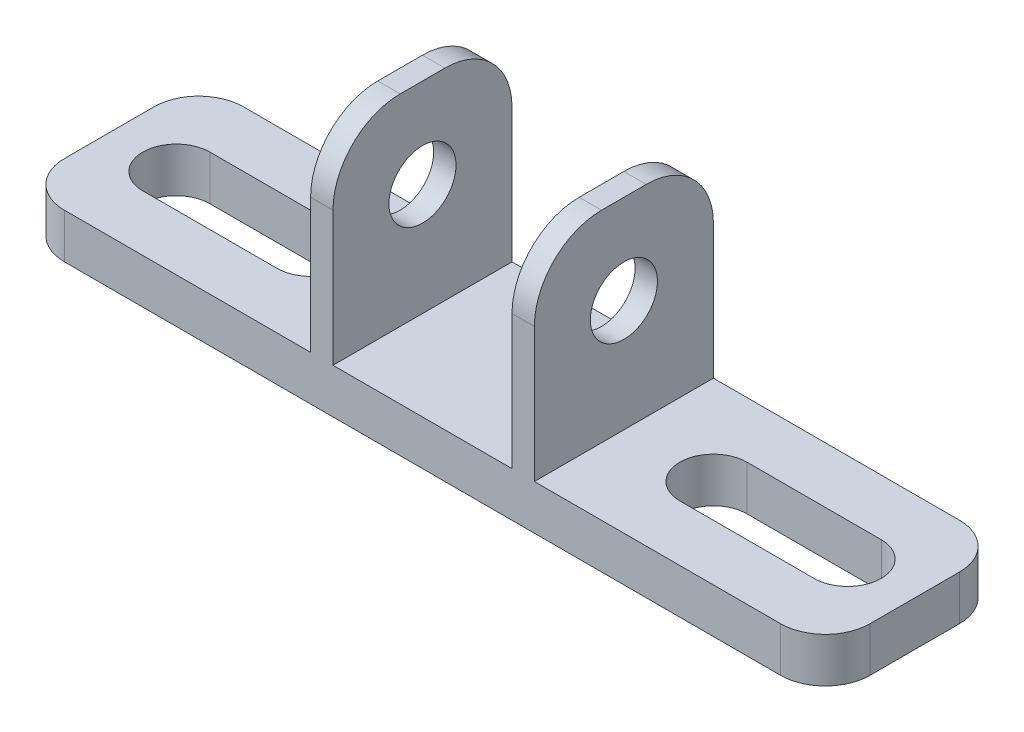
ISO-10303-21;
HEADER;
FILE_DESCRIPTION(('STEP AP214'),'2;1');
FILE_NAME('part.step','',(''),(''),'','','');
FILE_SCHEMA(('AUTOMOTIVE_DESIGN { 1 0 10303 214 1 1 1 1 }'));
ENDSEC;
DATA;
#1=APPLICATION_CONTEXT('core data for automotive mechanical design processes');
#2=APPLICATION_PROTOCOL_DEFINITION('international standard','automotive_design',2000,#1);
#3=PRODUCT_CONTEXT('',#1,'mechanical');
#4=PRODUCT('Part','Part','',(#3));
#5=PRODUCT_RELATED_PRODUCT_CATEGORY('part','',(#4));
#6=PRODUCT_DEFINITION_FORMATION('','',#4);
#7=PRODUCT_DEFINITION_CONTEXT('part definition',#1,'design');
#8=PRODUCT_DEFINITION('design','',#6,#7);
#9=PRODUCT_DEFINITION_SHAPE('','',#8);
#10=(LENGTH_UNIT() NAMED_UNIT(*) SI_UNIT(.MILLI.,.METRE.));
#11=(NAMED_UNIT(*) PLANE_ANGLE_UNIT() SI_UNIT($,.RADIAN.));
#12=(NAMED_UNIT(*) SI_UNIT($,.STERADIAN.) SOLID_ANGLE_UNIT());
#13=UNCERTAINTY_MEASURE_WITH_UNIT(LENGTH_MEASURE(1.E-05),#10,'distance_accuracy_value','');
#14=(GEOMETRIC_REPRESENTATION_CONTEXT(3) GLOBAL_UNCERTAINTY_ASSIGNED_CONTEXT((#13)) GLOBAL_UNIT_ASSIGNED_CONTEXT((#10,
#11,#12)) REPRESENTATION_CONTEXT('',''));
#15=CARTESIAN_POINT('',(0.,0.,0.));
#16=DIRECTION('',(0.,0.,1.));
#17=DIRECTION('',(1.,0.,0.));
#18=AXIS2_PLACEMENT_3D('',#15,#16,#17);
#19=CARTESIAN_POINT('',(16.,2.,2.));
#20=DIRECTION('',(0.,1.,0.));
#21=DIRECTION('',(0.,0.,1.));
#22=AXIS2_PLACEMENT_3D('',#19,#20,#21);
#23=PLANE('',#22);
#24=DIRECTION('',(-1.,0.,0.));
#25=VECTOR('',#24,1.);
#26=CARTESIAN_POINT('',(-9.,2.,-1.5));
#27=LINE('',#26,#25);
#28=CARTESIAN_POINT('',(-9.,2.,-1.5));
#29=VERTEX_POINT('',#28);
#30=CARTESIAN_POINT('',(-15.,2.,-1.5));
#31=VERTEX_POINT('',#30);
#32=EDGE_CURVE('E320',#29,#31,#27,.T.);
#33=ORIENTED_EDGE('',*,*,#32,.F.);
#34=CARTESIAN_POINT('',(-9.,2.,0.));
#35=DIRECTION('',(0.,1.,0.));
#36=DIRECTION('',(0.,0.,1.));
#37=AXIS2_PLACEMENT_3D('',#34,#35,#36);
#38=CIRCLE('',#37,1.5);
#39=CARTESIAN_POINT('',(-9.,2.,1.5));
#40=VERTEX_POINT('',#39);
#41=EDGE_CURVE('E318',#40,#29,#38,.T.);
#42=ORIENTED_EDGE('',*,*,#41,.F.);
#43=DIRECTION('',(1.,0.,0.));
#44=VECTOR('',#43,1.);
#45=CARTESIAN_POINT('',(-9.,2.,1.5));
#46=LINE('',#45,#44);
#47=CARTESIAN_POINT('',(-15.,2.,1.5));
#48=VERTEX_POINT('',#47);
#49=EDGE_CURVE('E326',#48,#40,#46,.T.);
#50=ORIENTED_EDGE('',*,*,#49,.F.);
#51=CARTESIAN_POINT('',(-15.,2.,0.));
#52=DIRECTION('',(0.,1.,0.));
#53=DIRECTION('',(0.,0.,1.));
#54=AXIS2_PLACEMENT_3D('',#51,#52,#53);
#55=CIRCLE('',#54,1.5);
#56=EDGE_CURVE('E323',#31,#48,#55,.T.);
#57=ORIENTED_EDGE('',*,*,#56,.F.);
#58=EDGE_LOOP('',(#33,#42,#50,#57));
#59=FACE_BOUND('',#58,.T.);
#60=DIRECTION('',(1.,0.,0.));
#61=VECTOR('',#60,1.);
#62=CARTESIAN_POINT('',(-16.,2.,4.));
#63=LINE('',#62,#61);
#64=CARTESIAN_POINT('',(-16.,2.,4.));
#65=VERTEX_POINT('',#64);
#66=CARTESIAN_POINT('',(-5.,2.,4.));
#67=VERTEX_POINT('',#66);
#68=EDGE_CURVE('E250',#65,#67,#63,.T.);
#69=ORIENTED_EDGE('',*,*,#68,.T.);
#70=DIRECTION('',(0.,0.,1.));
#71=VECTOR('',#70,1.);
#72=CARTESIAN_POINT('',(-5.,2.,-4.));
#73=LINE('',#72,#71);
#74=CARTESIAN_POINT('',(-5.,2.,-4.));
#75=VERTEX_POINT('',#74);
#76=EDGE_CURVE('E257',#75,#67,#73,.T.);
#77=ORIENTED_EDGE('',*,*,#76,.F.);
#78=DIRECTION('',(-1.,0.,0.));
#79=VECTOR('',#78,1.);
#80=CARTESIAN_POINT('',(-16.,2.,-4.));
#81=LINE('',#80,#79);
#82=CARTESIAN_POINT('',(-16.,2.,-4.));
#83=VERTEX_POINT('',#82);
#84=EDGE_CURVE('E357',#75,#83,#81,.T.);
#85=ORIENTED_EDGE('',*,*,#84,.T.);
#86=CARTESIAN_POINT('',(-16.,2.,-2.));
#87=DIRECTION('',(0.,1.,0.));
#88=DIRECTION('',(0.,0.,-1.));
#89=AXIS2_PLACEMENT_3D('',#86,#87,#88);
#90=CIRCLE('',#89,2.);
#91=CARTESIAN_POINT('',(-18.,2.,-2.));
#92=VERTEX_POINT('',#91);
#93=EDGE_CURVE('E361',#83,#92,#90,.T.);
#94=ORIENTED_EDGE('',*,*,#93,.T.);
#95=DIRECTION('',(0.,0.,1.));
#96=VECTOR('',#95,1.);
#97=CARTESIAN_POINT('',(-18.,2.,-2.));
#98=LINE('',#97,#96);
#99=CARTESIAN_POINT('',(-18.,2.,2.));
#100=VERTEX_POINT('',#99);
#101=EDGE_CURVE('E363',#92,#100,#98,.T.);
#102=ORIENTED_EDGE('',*,*,#101,.T.);
#103=CARTESIAN_POINT('',(-16.,2.,2.));
#104=DIRECTION('',(0.,1.,0.));
#105=DIRECTION('',(0.,0.,-1.));
#106=AXIS2_PLACEMENT_3D('',#103,#104,#105);
#107=CIRCLE('',#106,2.);
#108=EDGE_CURVE('E365',#100,#65,#107,.T.);
#109=ORIENTED_EDGE('',*,*,#108,.T.);
#110=EDGE_LOOP('',(#69,#77,#85,#94,#102,#109));
#111=FACE_BOUND('',#110,.T.);
#112=ADVANCED_FACE('F45',(#59,#111),#23,.T.);
#113=CARTESIAN_POINT('',(4.,2.,-4.));
#114=VERTEX_POINT('',#113);
#115=CARTESIAN_POINT('',(-4.,2.,-4.));
#116=VERTEX_POINT('',#115);
#117=EDGE_CURVE('E256',#114,#116,#81,.T.);
#118=ORIENTED_EDGE('',*,*,#117,.T.);
#119=DIRECTION('',(0.,0.,-1.));
#120=VECTOR('',#119,1.);
#121=CARTESIAN_POINT('',(-4.,2.,-4.));
#122=LINE('',#121,#120);
#123=CARTESIAN_POINT('',(-4.,2.,4.));
#124=VERTEX_POINT('',#123);
#125=EDGE_CURVE('E236',#124,#116,#122,.T.);
#126=ORIENTED_EDGE('',*,*,#125,.F.);
#127=CARTESIAN_POINT('',(4.,2.,4.));
#128=VERTEX_POINT('',#127);
#129=EDGE_CURVE('E242',#124,#128,#63,.T.);
#130=ORIENTED_EDGE('',*,*,#129,.T.);
#131=DIRECTION('',(0.,0.,1.));
#132=VECTOR('',#131,1.);
#133=CARTESIAN_POINT('',(4.,2.,-4.));
#134=LINE('',#133,#132);
#135=EDGE_CURVE('E261',#114,#128,#134,.T.);
#136=ORIENTED_EDGE('',*,*,#135,.F.);
#137=EDGE_LOOP('',(#118,#126,#130,#136));
#138=FACE_BOUND('',#137,.T.);
#139=ADVANCED_FACE('F254',(#138),#23,.T.);
#140=DIRECTION('',(0.,0.,-1.));
#141=VECTOR('',#140,1.);
#142=CARTESIAN_POINT('',(5.,2.,-4.));
#143=LINE('',#142,#141);
#144=CARTESIAN_POINT('',(5.,2.,4.));
#145=VERTEX_POINT('',#144);
#146=CARTESIAN_POINT('',(5.,2.,-4.));
#147=VERTEX_POINT('',#146);
#148=EDGE_CURVE('E273',#145,#147,#143,.T.);
#149=ORIENTED_EDGE('',*,*,#148,.F.);
#150=CARTESIAN_POINT('',(16.,2.,4.));
#151=VERTEX_POINT('',#150);
#152=EDGE_CURVE('E251',#145,#151,#63,.T.);
#153=ORIENTED_EDGE('',*,*,#152,.T.);
#154=CARTESIAN_POINT('',(16.,2.,2.));
#155=DIRECTION('',(0.,1.,0.));
#156=DIRECTION('',(0.,0.,1.));
#157=AXIS2_PLACEMENT_3D('',#154,#155,#156);
#158=CIRCLE('',#157,2.);
#159=CARTESIAN_POINT('',(18.,2.,2.));
#160=VERTEX_POINT('',#159);
#161=EDGE_CURVE('E349',#151,#160,#158,.T.);
#162=ORIENTED_EDGE('',*,*,#161,.T.);
#163=DIRECTION('',(0.,0.,-1.));
#164=VECTOR('',#163,1.);
#165=CARTESIAN_POINT('',(18.,2.,-2.));
#166=LINE('',#165,#164);
#167=CARTESIAN_POINT('',(18.,2.,-2.));
#168=VERTEX_POINT('',#167);
#169=EDGE_CURVE('E352',#160,#168,#166,.T.);
#170=ORIENTED_EDGE('',*,*,#169,.T.);
#171=CARTESIAN_POINT('',(16.,2.,-2.));
#172=DIRECTION('',(0.,1.,0.));
#173=DIRECTION('',(0.,0.,1.));
#174=AXIS2_PLACEMENT_3D('',#171,#172,#173);
#175=CIRCLE('',#174,2.);
#176=CARTESIAN_POINT('',(16.,2.,-4.));
#177=VERTEX_POINT('',#176);
#178=EDGE_CURVE('E355',#168,#177,#175,.T.);
#179=ORIENTED_EDGE('',*,*,#178,.T.);
#180=EDGE_CURVE('E358',#177,#147,#81,.T.);
#181=ORIENTED_EDGE('',*,*,#180,.T.);
#182=EDGE_LOOP('',(#149,#153,#162,#170,#179,#181));
#183=FACE_BOUND('',#182,.T.);
#184=DIRECTION('',(1.,0.,0.));
#185=VECTOR('',#184,1.);
#186=CARTESIAN_POINT('',(9.,2.,1.5));
#187=LINE('',#186,#185);
#188=CARTESIAN_POINT('',(9.,2.,1.5));
#189=VERTEX_POINT('',#188);
#190=CARTESIAN_POINT('',(15.,2.,1.5));
#191=VERTEX_POINT('',#190);
#192=EDGE_CURVE('E289',#189,#191,#187,.T.);
#193=ORIENTED_EDGE('',*,*,#192,.F.);
#194=CARTESIAN_POINT('',(9.,2.,0.));
#195=DIRECTION('',(0.,1.,0.));
#196=DIRECTION('',(0.,0.,1.));
#197=AXIS2_PLACEMENT_3D('',#194,#195,#196);
#198=CIRCLE('',#197,1.5);
#199=CARTESIAN_POINT('',(9.,2.,-1.5));
#200=VERTEX_POINT('',#199);
#201=EDGE_CURVE('E287',#200,#189,#198,.T.);
#202=ORIENTED_EDGE('',*,*,#201,.F.);
#203=DIRECTION('',(-1.,0.,0.));
#204=VECTOR('',#203,1.);
#205=CARTESIAN_POINT('',(9.,2.,-1.5));
#206=LINE('',#205,#204);
#207=CARTESIAN_POINT('',(15.,2.,-1.5));
#208=VERTEX_POINT('',#207);
#209=EDGE_CURVE('E295',#208,#200,#206,.T.);
#210=ORIENTED_EDGE('',*,*,#209,.F.);
#211=CARTESIAN_POINT('',(15.,2.,0.));
#212=DIRECTION('',(0.,1.,0.));
#213=DIRECTION('',(0.,0.,1.));
#214=AXIS2_PLACEMENT_3D('',#211,#212,#213);
#215=CIRCLE('',#214,1.5);
#216=EDGE_CURVE('E292',#191,#208,#215,.T.);
#217=ORIENTED_EDGE('',*,*,#216,.F.);
#218=EDGE_LOOP('',(#193,#202,#210,#217));
#219=FACE_BOUND('',#218,.T.);
#220=ADVANCED_FACE('F487',(#183,#219),#23,.T.);
#221=CARTESIAN_POINT('',(16.,0.,2.));
#222=DIRECTION('',(0.,1.,0.));
#223=DIRECTION('',(0.,0.,1.));
#224=AXIS2_PLACEMENT_3D('',#221,#222,#223);
#225=PLANE('',#224);
#226=CARTESIAN_POINT('',(-9.,0.,0.));
#227=DIRECTION('',(0.,1.,0.));
#228=DIRECTION('',(0.,0.,1.));
#229=AXIS2_PLACEMENT_3D('',#226,#227,#228);
#230=CIRCLE('',#229,1.5);
#231=CARTESIAN_POINT('',(-9.,0.,1.5));
#232=VERTEX_POINT('',#231);
#233=CARTESIAN_POINT('',(-9.,0.,-1.5));
#234=VERTEX_POINT('',#233);
#235=EDGE_CURVE('E317',#232,#234,#230,.T.);
#236=ORIENTED_EDGE('',*,*,#235,.T.);
#237=DIRECTION('',(-1.,0.,0.));
#238=VECTOR('',#237,1.);
#239=CARTESIAN_POINT('',(-9.,0.,-1.5));
#240=LINE('',#239,#238);
#241=CARTESIAN_POINT('',(-15.,0.,-1.5));
#242=VERTEX_POINT('',#241);
#243=EDGE_CURVE('E331',#234,#242,#240,.T.);
#244=ORIENTED_EDGE('',*,*,#243,.T.);
#245=CARTESIAN_POINT('',(-15.,0.,0.));
#246=DIRECTION('',(0.,1.,0.));
#247=DIRECTION('',(0.,0.,1.));
#248=AXIS2_PLACEMENT_3D('',#245,#246,#247);
#249=CIRCLE('',#248,1.5);
#250=CARTESIAN_POINT('',(-15.,0.,1.5));
#251=VERTEX_POINT('',#250);
#252=EDGE_CURVE('E334',#242,#251,#249,.T.);
#253=ORIENTED_EDGE('',*,*,#252,.T.);
#254=DIRECTION('',(1.,0.,0.));
#255=VECTOR('',#254,1.);
#256=CARTESIAN_POINT('',(-9.,0.,1.5));
#257=LINE('',#256,#255);
#258=EDGE_CURVE('E321',#251,#232,#257,.T.);
#259=ORIENTED_EDGE('',*,*,#258,.T.);
#260=EDGE_LOOP('',(#236,#244,#253,#259));
#261=FACE_BOUND('',#260,.T.);
#262=CARTESIAN_POINT('',(16.,0.,2.));
#263=DIRECTION('',(0.,1.,0.));
#264=DIRECTION('',(0.,0.,1.));
#265=AXIS2_PLACEMENT_3D('',#262,#263,#264);
#266=CIRCLE('',#265,2.);
#267=CARTESIAN_POINT('',(16.,0.,4.));
#268=VERTEX_POINT('',#267);
#269=CARTESIAN_POINT('',(18.,0.,2.));
#270=VERTEX_POINT('',#269);
#271=EDGE_CURVE('E348',#268,#270,#266,.T.);
#272=ORIENTED_EDGE('',*,*,#271,.F.);
#273=DIRECTION('',(1.,0.,0.));
#274=VECTOR('',#273,1.);
#275=CARTESIAN_POINT('',(-16.,0.,4.));
#276=LINE('',#275,#274);
#277=CARTESIAN_POINT('',(-16.,0.,4.));
#278=VERTEX_POINT('',#277);
#279=EDGE_CURVE('E353',#278,#268,#276,.T.);
#280=ORIENTED_EDGE('',*,*,#279,.F.);
#281=CARTESIAN_POINT('',(-16.,0.,2.));
#282=DIRECTION('',(0.,1.,0.));
#283=DIRECTION('',(0.,0.,-1.));
#284=AXIS2_PLACEMENT_3D('',#281,#282,#283);
#285=CIRCLE('',#284,2.);
#286=CARTESIAN_POINT('',(-18.,0.,2.));
#287=VERTEX_POINT('',#286);
#288=EDGE_CURVE('E381',#287,#278,#285,.T.);
#289=ORIENTED_EDGE('',*,*,#288,.F.);
#290=DIRECTION('',(0.,0.,1.));
#291=VECTOR('',#290,1.);
#292=CARTESIAN_POINT('',(-18.,0.,-2.));
#293=LINE('',#292,#291);
#294=CARTESIAN_POINT('',(-18.,0.,-2.));
#295=VERTEX_POINT('',#294);
#296=EDGE_CURVE('E379',#295,#287,#293,.T.);
#297=ORIENTED_EDGE('',*,*,#296,.F.);
#298=CARTESIAN_POINT('',(-16.,0.,-2.));
#299=DIRECTION('',(0.,1.,0.));
#300=DIRECTION('',(0.,0.,-1.));
#301=AXIS2_PLACEMENT_3D('',#298,#299,#300);
#302=CIRCLE('',#301,2.);
#303=CARTESIAN_POINT('',(-16.,0.,-4.));
#304=VERTEX_POINT('',#303);
#305=EDGE_CURVE('E377',#304,#295,#302,.T.);
#306=ORIENTED_EDGE('',*,*,#305,.F.);
#307=DIRECTION('',(-1.,0.,0.));
#308=VECTOR('',#307,1.);
#309=CARTESIAN_POINT('',(-16.,0.,-4.));
#310=LINE('',#309,#308);
#311=CARTESIAN_POINT('',(16.,0.,-4.));
#312=VERTEX_POINT('',#311);
#313=EDGE_CURVE('E375',#312,#304,#310,.T.);
#314=ORIENTED_EDGE('',*,*,#313,.F.);
#315=CARTESIAN_POINT('',(16.,0.,-2.));
#316=DIRECTION('',(0.,1.,0.));
#317=DIRECTION('',(0.,0.,1.));
#318=AXIS2_PLACEMENT_3D('',#315,#316,#317);
#319=CIRCLE('',#318,2.);
#320=CARTESIAN_POINT('',(18.,0.,-2.));
#321=VERTEX_POINT('',#320);
#322=EDGE_CURVE('E373',#321,#312,#319,.T.);
#323=ORIENTED_EDGE('',*,*,#322,.F.);
#324=DIRECTION('',(0.,0.,-1.));
#325=VECTOR('',#324,1.);
#326=CARTESIAN_POINT('',(18.,0.,-2.));
#327=LINE('',#326,#325);
#328=EDGE_CURVE('E371',#270,#321,#327,.T.);
#329=ORIENTED_EDGE('',*,*,#328,.F.);
#330=EDGE_LOOP('',(#272,#280,#289,#297,#306,#314,#323,#329));
#331=FACE_BOUND('',#330,.T.);
#332=CARTESIAN_POINT('',(9.,0.,0.));
#333=DIRECTION('',(0.,1.,0.));
#334=DIRECTION('',(0.,0.,1.));
#335=AXIS2_PLACEMENT_3D('',#332,#333,#334);
#336=CIRCLE('',#335,1.5);
#337=CARTESIAN_POINT('',(9.,0.,-1.5));
#338=VERTEX_POINT('',#337);
#339=CARTESIAN_POINT('',(9.,0.,1.5));
#340=VERTEX_POINT('',#339);
#341=EDGE_CURVE('E286',#338,#340,#336,.T.);
#342=ORIENTED_EDGE('',*,*,#341,.T.);
#343=DIRECTION('',(1.,0.,0.));
#344=VECTOR('',#343,1.);
#345=CARTESIAN_POINT('',(9.,0.,1.5));
#346=LINE('',#345,#344);
#347=CARTESIAN_POINT('',(15.,0.,1.5));
#348=VERTEX_POINT('',#347);
#349=EDGE_CURVE('E300',#340,#348,#346,.T.);
#350=ORIENTED_EDGE('',*,*,#349,.T.);
#351=CARTESIAN_POINT('',(15.,0.,0.));
#352=DIRECTION('',(0.,1.,0.));
#353=DIRECTION('',(0.,0.,1.));
#354=AXIS2_PLACEMENT_3D('',#351,#352,#353);
#355=CIRCLE('',#354,1.5);
#356=CARTESIAN_POINT('',(15.,0.,-1.5));
#357=VERTEX_POINT('',#356);
#358=EDGE_CURVE('E303',#348,#357,#355,.T.);
#359=ORIENTED_EDGE('',*,*,#358,.T.);
#360=DIRECTION('',(-1.,0.,0.));
#361=VECTOR('',#360,1.);
#362=CARTESIAN_POINT('',(9.,0.,-1.5));
#363=LINE('',#362,#361);
#364=EDGE_CURVE('E290',#357,#338,#363,.T.);
#365=ORIENTED_EDGE('',*,*,#364,.T.);
#366=EDGE_LOOP('',(#342,#350,#359,#365));
#367=FACE_BOUND('',#366,.T.);
#368=ADVANCED_FACE('F497',(#261,#331,#367),#225,.F.);
#369=CARTESIAN_POINT('',(16.,2.,2.));
#370=DIRECTION('',(0.,-1.,0.));
#371=DIRECTION('',(0.,0.,-1.));
#372=AXIS2_PLACEMENT_3D('',#369,#370,#371);
#373=CYLINDRICAL_SURFACE('',#372,2.);
#374=ORIENTED_EDGE('',*,*,#271,.T.);
#375=DIRECTION('',(0.,-1.,0.));
#376=VECTOR('',#375,1.);
#377=CARTESIAN_POINT('',(18.,2.,2.));
#378=LINE('',#377,#376);
#379=EDGE_CURVE('E404',#160,#270,#378,.T.);
#380=ORIENTED_EDGE('',*,*,#379,.F.);
#381=ORIENTED_EDGE('',*,*,#161,.F.);
#382=DIRECTION('',(0.,-1.,0.));
#383=VECTOR('',#382,1.);
#384=CARTESIAN_POINT('',(16.,2.,4.));
#385=LINE('',#384,#383);
#386=EDGE_CURVE('E368',#151,#268,#385,.T.);
#387=ORIENTED_EDGE('',*,*,#386,.T.);
#388=EDGE_LOOP('',(#374,#380,#381,#387));
#389=FACE_BOUND('',#388,.T.);
#390=ADVANCED_FACE('F503',(#389),#373,.T.);
#391=CARTESIAN_POINT('',(18.,2.,-2.));
#392=DIRECTION('',(-1.,0.,0.));
#393=DIRECTION('',(0.,0.,1.));
#394=AXIS2_PLACEMENT_3D('',#391,#392,#393);
#395=PLANE('',#394);
#396=ORIENTED_EDGE('',*,*,#328,.T.);
#397=DIRECTION('',(0.,-1.,0.));
#398=VECTOR('',#397,1.);
#399=CARTESIAN_POINT('',(18.,2.,-2.));
#400=LINE('',#399,#398);
#401=EDGE_CURVE('E401',#168,#321,#400,.T.);
#402=ORIENTED_EDGE('',*,*,#401,.F.);
#403=ORIENTED_EDGE('',*,*,#169,.F.);
#404=ORIENTED_EDGE('',*,*,#379,.T.);
#405=EDGE_LOOP('',(#396,#402,#403,#404));
#406=FACE_BOUND('',#405,.T.);
#407=ADVANCED_FACE('F600',(#406),#395,.F.);
#408=CARTESIAN_POINT('',(16.,2.,-2.));
#409=DIRECTION('',(0.,-1.,0.));
#410=DIRECTION('',(0.,0.,-1.));
#411=AXIS2_PLACEMENT_3D('',#408,#409,#410);
#412=CYLINDRICAL_SURFACE('',#411,2.);
#413=ORIENTED_EDGE('',*,*,#322,.T.);
#414=DIRECTION('',(0.,-1.,0.));
#415=VECTOR('',#414,1.);
#416=CARTESIAN_POINT('',(16.,2.,-4.));
#417=LINE('',#416,#415);
#418=EDGE_CURVE('E398',#177,#312,#417,.T.);
#419=ORIENTED_EDGE('',*,*,#418,.F.);
#420=ORIENTED_EDGE('',*,*,#178,.F.);
#421=ORIENTED_EDGE('',*,*,#401,.T.);
#422=EDGE_LOOP('',(#413,#419,#420,#421));
#423=FACE_BOUND('',#422,.T.);
#424=ADVANCED_FACE('F596',(#423),#412,.T.);
#425=CARTESIAN_POINT('',(-16.,2.,-4.));
#426=DIRECTION('',(0.,0.,1.));
#427=DIRECTION('',(1.,0.,0.));
#428=AXIS2_PLACEMENT_3D('',#425,#426,#427);
#429=PLANE('',#428);
#430=DIRECTION('',(0.,-1.,0.));
#431=VECTOR('',#430,1.);
#432=CARTESIAN_POINT('',(4.,11.,-4.));
#433=LINE('',#432,#431);
#434=CARTESIAN_POINT('',(4.,8.,-4.));
#435=VERTEX_POINT('',#434);
#436=EDGE_CURVE('E284',#435,#114,#433,.T.);
#437=ORIENTED_EDGE('',*,*,#436,.F.);
#438=DIRECTION('',(-1.,0.,0.));
#439=VECTOR('',#438,1.);
#440=CARTESIAN_POINT('',(-16.,8.,-4.));
#441=LINE('',#440,#439);
#442=CARTESIAN_POINT('',(5.,8.,-4.));
#443=VERTEX_POINT('',#442);
#444=EDGE_CURVE('E419',#435,#443,#441,.F.);
#445=ORIENTED_EDGE('',*,*,#444,.T.);
#446=DIRECTION('',(0.,-1.,0.));
#447=VECTOR('',#446,1.);
#448=CARTESIAN_POINT('',(5.,11.,-4.));
#449=LINE('',#448,#447);
#450=EDGE_CURVE('E276',#443,#147,#449,.T.);
#451=ORIENTED_EDGE('',*,*,#450,.T.);
#452=ORIENTED_EDGE('',*,*,#180,.F.);
#453=ORIENTED_EDGE('',*,*,#418,.T.);
#454=ORIENTED_EDGE('',*,*,#313,.T.);
#455=DIRECTION('',(0.,-1.,0.));
#456=VECTOR('',#455,1.);
#457=CARTESIAN_POINT('',(-16.,2.,-4.));
#458=LINE('',#457,#456);
#459=EDGE_CURVE('E395',#83,#304,#458,.T.);
#460=ORIENTED_EDGE('',*,*,#459,.F.);
#461=ORIENTED_EDGE('',*,*,#84,.F.);
#462=DIRECTION('',(0.,-1.,0.));
#463=VECTOR('',#462,1.);
#464=CARTESIAN_POINT('',(-5.,11.,-4.));
#465=LINE('',#464,#463);
#466=CARTESIAN_POINT('',(-5.,8.,-4.));
#467=VERTEX_POINT('',#466);
#468=EDGE_CURVE('E441',#467,#75,#465,.T.);
#469=ORIENTED_EDGE('',*,*,#468,.F.);
#470=DIRECTION('',(-1.,0.,0.));
#471=VECTOR('',#470,1.);
#472=CARTESIAN_POINT('',(-16.,8.,-4.));
#473=LINE('',#472,#471);
#474=CARTESIAN_POINT('',(-4.,8.,-4.));
#475=VERTEX_POINT('',#474);
#476=EDGE_CURVE('E417',#467,#475,#473,.F.);
#477=ORIENTED_EDGE('',*,*,#476,.T.);
#478=DIRECTION('',(0.,-1.,0.));
#479=VECTOR('',#478,1.);
#480=CARTESIAN_POINT('',(-4.,11.,-4.));
#481=LINE('',#480,#479);
#482=EDGE_CURVE('E238',#475,#116,#481,.T.);
#483=ORIENTED_EDGE('',*,*,#482,.T.);
#484=ORIENTED_EDGE('',*,*,#117,.F.);
#485=EDGE_LOOP('',(#437,#445,#451,#452,#453,#454,#460,#461,#469,#477,#483,#484));
#486=FACE_BOUND('',#485,.T.);
#487=ADVANCED_FACE('F449',(#486),#429,.F.);
#488=CARTESIAN_POINT('',(-16.,2.,-2.));
#489=DIRECTION('',(0.,-1.,0.));
#490=DIRECTION('',(0.,0.,-1.));
#491=AXIS2_PLACEMENT_3D('',#488,#489,#490);
#492=CYLINDRICAL_SURFACE('',#491,2.);
#493=ORIENTED_EDGE('',*,*,#305,.T.);
#494=DIRECTION('',(0.,-1.,0.));
#495=VECTOR('',#494,1.);
#496=CARTESIAN_POINT('',(-18.,2.,-2.));
#497=LINE('',#496,#495);
#498=EDGE_CURVE('E392',#92,#295,#497,.T.);
#499=ORIENTED_EDGE('',*,*,#498,.F.);
#500=ORIENTED_EDGE('',*,*,#93,.F.);
#501=ORIENTED_EDGE('',*,*,#459,.T.);
#502=EDGE_LOOP('',(#493,#499,#500,#501));
#503=FACE_BOUND('',#502,.T.);
#504=ADVANCED_FACE('F592',(#503),#492,.T.);
#505=CARTESIAN_POINT('',(-18.,2.,-2.));
#506=DIRECTION('',(1.,0.,0.));
#507=DIRECTION('',(0.,0.,-1.));
#508=AXIS2_PLACEMENT_3D('',#505,#506,#507);
#509=PLANE('',#508);
#510=ORIENTED_EDGE('',*,*,#296,.T.);
#511=DIRECTION('',(0.,-1.,0.));
#512=VECTOR('',#511,1.);
#513=CARTESIAN_POINT('',(-18.,2.,2.));
#514=LINE('',#513,#512);
#515=EDGE_CURVE('E389',#100,#287,#514,.T.);
#516=ORIENTED_EDGE('',*,*,#515,.F.);
#517=ORIENTED_EDGE('',*,*,#101,.F.);
#518=ORIENTED_EDGE('',*,*,#498,.T.);
#519=EDGE_LOOP('',(#510,#516,#517,#518));
#520=FACE_BOUND('',#519,.T.);
#521=ADVANCED_FACE('F587',(#520),#509,.F.);
#522=CARTESIAN_POINT('',(-16.,2.,2.));
#523=DIRECTION('',(0.,-1.,0.));
#524=DIRECTION('',(0.,0.,-1.));
#525=AXIS2_PLACEMENT_3D('',#522,#523,#524);
#526=CYLINDRICAL_SURFACE('',#525,2.);
#527=ORIENTED_EDGE('',*,*,#288,.T.);
#528=DIRECTION('',(0.,-1.,0.));
#529=VECTOR('',#528,1.);
#530=CARTESIAN_POINT('',(-16.,2.,4.));
#531=LINE('',#530,#529);
#532=EDGE_CURVE('E386',#65,#278,#531,.T.);
#533=ORIENTED_EDGE('',*,*,#532,.F.);
#534=ORIENTED_EDGE('',*,*,#108,.F.);
#535=ORIENTED_EDGE('',*,*,#515,.T.);
#536=EDGE_LOOP('',(#527,#533,#534,#535));
#537=FACE_BOUND('',#536,.T.);
#538=ADVANCED_FACE('F560',(#537),#526,.T.);
#539=CARTESIAN_POINT('',(-16.,2.,4.));
#540=DIRECTION('',(0.,0.,-1.));
#541=DIRECTION('',(-1.,0.,0.));
#542=AXIS2_PLACEMENT_3D('',#539,#540,#541);
#543=PLANE('',#542);
#544=DIRECTION('',(0.,-1.,0.));
#545=VECTOR('',#544,1.);
#546=CARTESIAN_POINT('',(5.,11.,4.));
#547=LINE('',#546,#545);
#548=CARTESIAN_POINT('',(5.,8.,4.));
#549=VERTEX_POINT('',#548);
#550=EDGE_CURVE('E281',#549,#145,#547,.T.);
#551=ORIENTED_EDGE('',*,*,#550,.F.);
#552=DIRECTION('',(1.,0.,0.));
#553=VECTOR('',#552,1.);
#554=CARTESIAN_POINT('',(-16.,8.,4.));
#555=LINE('',#554,#553);
#556=CARTESIAN_POINT('',(4.,8.,4.));
#557=VERTEX_POINT('',#556);
#558=EDGE_CURVE('E427',#549,#557,#555,.F.);
#559=ORIENTED_EDGE('',*,*,#558,.T.);
#560=DIRECTION('',(0.,-1.,0.));
#561=VECTOR('',#560,1.);
#562=CARTESIAN_POINT('',(4.,11.,4.));
#563=LINE('',#562,#561);
#564=EDGE_CURVE('E246',#557,#128,#563,.T.);
#565=ORIENTED_EDGE('',*,*,#564,.T.);
#566=ORIENTED_EDGE('',*,*,#129,.F.);
#567=DIRECTION('',(0.,-1.,0.));
#568=VECTOR('',#567,1.);
#569=CARTESIAN_POINT('',(-4.,11.,4.));
#570=LINE('',#569,#568);
#571=CARTESIAN_POINT('',(-4.,8.,4.));
#572=VERTEX_POINT('',#571);
#573=EDGE_CURVE('E232',#572,#124,#570,.T.);
#574=ORIENTED_EDGE('',*,*,#573,.F.);
#575=DIRECTION('',(1.,0.,0.));
#576=VECTOR('',#575,1.);
#577=CARTESIAN_POINT('',(-16.,8.,4.));
#578=LINE('',#577,#576);
#579=CARTESIAN_POINT('',(-5.,8.,4.));
#580=VERTEX_POINT('',#579);
#581=EDGE_CURVE('E425',#572,#580,#578,.F.);
#582=ORIENTED_EDGE('',*,*,#581,.T.);
#583=DIRECTION('',(0.,-1.,0.));
#584=VECTOR('',#583,1.);
#585=CARTESIAN_POINT('',(-5.,11.,4.));
#586=LINE('',#585,#584);
#587=EDGE_CURVE('E239',#580,#67,#586,.T.);
#588=ORIENTED_EDGE('',*,*,#587,.T.);
#589=ORIENTED_EDGE('',*,*,#68,.F.);
#590=ORIENTED_EDGE('',*,*,#532,.T.);
#591=ORIENTED_EDGE('',*,*,#279,.T.);
#592=ORIENTED_EDGE('',*,*,#386,.F.);
#593=ORIENTED_EDGE('',*,*,#152,.F.);
#594=EDGE_LOOP('',(#551,#559,#565,#566,#574,#582,#588,#589,#590,#591,#592,#593));
#595=FACE_BOUND('',#594,.T.);
#596=ADVANCED_FACE('F244',(#595),#543,.F.);
#597=CARTESIAN_POINT('',(-9.,2.,0.));
#598=DIRECTION('',(0.,-1.,0.));
#599=DIRECTION('',(0.,0.,-1.));
#600=AXIS2_PLACEMENT_3D('',#597,#598,#599);
#601=CYLINDRICAL_SURFACE('',#600,1.5);
#602=ORIENTED_EDGE('',*,*,#235,.F.);
#603=DIRECTION('',(0.,-1.,0.));
#604=VECTOR('',#603,1.);
#605=CARTESIAN_POINT('',(-9.,2.,1.5));
#606=LINE('',#605,#604);
#607=EDGE_CURVE('E328',#40,#232,#606,.T.);
#608=ORIENTED_EDGE('',*,*,#607,.F.);
#609=ORIENTED_EDGE('',*,*,#41,.T.);
#610=DIRECTION('',(0.,-1.,0.));
#611=VECTOR('',#610,1.);
#612=CARTESIAN_POINT('',(-9.,2.,-1.5));
#613=LINE('',#612,#611);
#614=EDGE_CURVE('E345',#29,#234,#613,.T.);
#615=ORIENTED_EDGE('',*,*,#614,.T.);
#616=EDGE_LOOP('',(#602,#608,#609,#615));
#617=FACE_BOUND('',#616,.T.);
#618=ADVANCED_FACE('F552',(#617),#601,.F.);
#619=CARTESIAN_POINT('',(-9.,2.,-1.5));
#620=DIRECTION('',(0.,0.,1.));
#621=DIRECTION('',(1.,0.,0.));
#622=AXIS2_PLACEMENT_3D('',#619,#620,#621);
#623=PLANE('',#622);
#624=ORIENTED_EDGE('',*,*,#243,.F.);
#625=ORIENTED_EDGE('',*,*,#614,.F.);
#626=ORIENTED_EDGE('',*,*,#32,.T.);
#627=DIRECTION('',(0.,-1.,0.));
#628=VECTOR('',#627,1.);
#629=CARTESIAN_POINT('',(-15.,2.,-1.5));
#630=LINE('',#629,#628);
#631=EDGE_CURVE('E343',#31,#242,#630,.T.);
#632=ORIENTED_EDGE('',*,*,#631,.T.);
#633=EDGE_LOOP('',(#624,#625,#626,#632));
#634=FACE_BOUND('',#633,.T.);
#635=ADVANCED_FACE('F549',(#634),#623,.T.);
#636=CARTESIAN_POINT('',(-15.,2.,0.));
#637=DIRECTION('',(0.,-1.,0.));
#638=DIRECTION('',(0.,0.,-1.));
#639=AXIS2_PLACEMENT_3D('',#636,#637,#638);
#640=CYLINDRICAL_SURFACE('',#639,1.5);
#641=ORIENTED_EDGE('',*,*,#252,.F.);
#642=ORIENTED_EDGE('',*,*,#631,.F.);
#643=ORIENTED_EDGE('',*,*,#56,.T.);
#644=DIRECTION('',(0.,-1.,0.));
#645=VECTOR('',#644,1.);
#646=CARTESIAN_POINT('',(-15.,2.,1.5));
#647=LINE('',#646,#645);
#648=EDGE_CURVE('E341',#48,#251,#647,.T.);
#649=ORIENTED_EDGE('',*,*,#648,.T.);
#650=EDGE_LOOP('',(#641,#642,#643,#649));
#651=FACE_BOUND('',#650,.T.);
#652=ADVANCED_FACE('F545',(#651),#640,.F.);
#653=CARTESIAN_POINT('',(-9.,2.,1.5));
#654=DIRECTION('',(0.,0.,-1.));
#655=DIRECTION('',(-1.,0.,0.));
#656=AXIS2_PLACEMENT_3D('',#653,#654,#655);
#657=PLANE('',#656);
#658=ORIENTED_EDGE('',*,*,#258,.F.);
#659=ORIENTED_EDGE('',*,*,#648,.F.);
#660=ORIENTED_EDGE('',*,*,#49,.T.);
#661=ORIENTED_EDGE('',*,*,#607,.T.);
#662=EDGE_LOOP('',(#658,#659,#660,#661));
#663=FACE_BOUND('',#662,.T.);
#664=ADVANCED_FACE('F542',(#663),#657,.T.);
#665=CARTESIAN_POINT('',(9.,2.,0.));
#666=DIRECTION('',(0.,-1.,0.));
#667=DIRECTION('',(0.,0.,-1.));
#668=AXIS2_PLACEMENT_3D('',#665,#666,#667);
#669=CYLINDRICAL_SURFACE('',#668,1.5);
#670=ORIENTED_EDGE('',*,*,#341,.F.);
#671=DIRECTION('',(0.,-1.,0.));
#672=VECTOR('',#671,1.);
#673=CARTESIAN_POINT('',(9.,2.,-1.5));
#674=LINE('',#673,#672);
#675=EDGE_CURVE('E297',#200,#338,#674,.T.);
#676=ORIENTED_EDGE('',*,*,#675,.F.);
#677=ORIENTED_EDGE('',*,*,#201,.T.);
#678=DIRECTION('',(0.,-1.,0.));
#679=VECTOR('',#678,1.);
#680=CARTESIAN_POINT('',(9.,2.,1.5));
#681=LINE('',#680,#679);
#682=EDGE_CURVE('E314',#189,#340,#681,.T.);
#683=ORIENTED_EDGE('',*,*,#682,.T.);
#684=EDGE_LOOP('',(#670,#676,#677,#683));
#685=FACE_BOUND('',#684,.T.);
#686=ADVANCED_FACE('F522',(#685),#669,.F.);
#687=CARTESIAN_POINT('',(9.,2.,1.5));
#688=DIRECTION('',(0.,0.,-1.));
#689=DIRECTION('',(-1.,0.,0.));
#690=AXIS2_PLACEMENT_3D('',#687,#688,#689);
#691=PLANE('',#690);
#692=ORIENTED_EDGE('',*,*,#349,.F.);
#693=ORIENTED_EDGE('',*,*,#682,.F.);
#694=ORIENTED_EDGE('',*,*,#192,.T.);
#695=DIRECTION('',(0.,-1.,0.));
#696=VECTOR('',#695,1.);
#697=CARTESIAN_POINT('',(15.,2.,1.5));
#698=LINE('',#697,#696);
#699=EDGE_CURVE('E312',#191,#348,#698,.T.);
#700=ORIENTED_EDGE('',*,*,#699,.T.);
#701=EDGE_LOOP('',(#692,#693,#694,#700));
#702=FACE_BOUND('',#701,.T.);
#703=ADVANCED_FACE('F515',(#702),#691,.T.);
#704=CARTESIAN_POINT('',(15.,2.,0.));
#705=DIRECTION('',(0.,-1.,0.));
#706=DIRECTION('',(0.,0.,-1.));
#707=AXIS2_PLACEMENT_3D('',#704,#705,#706);
#708=CYLINDRICAL_SURFACE('',#707,1.5);
#709=ORIENTED_EDGE('',*,*,#358,.F.);
#710=ORIENTED_EDGE('',*,*,#699,.F.);
#711=ORIENTED_EDGE('',*,*,#216,.T.);
#712=DIRECTION('',(0.,-1.,0.));
#713=VECTOR('',#712,1.);
#714=CARTESIAN_POINT('',(15.,2.,-1.5));
#715=LINE('',#714,#713);
#716=EDGE_CURVE('E310',#208,#357,#715,.T.);
#717=ORIENTED_EDGE('',*,*,#716,.T.);
#718=EDGE_LOOP('',(#709,#710,#711,#717));
#719=FACE_BOUND('',#718,.T.);
#720=ADVANCED_FACE('F518',(#719),#708,.F.);
#721=CARTESIAN_POINT('',(9.,2.,-1.5));
#722=DIRECTION('',(0.,0.,1.));
#723=DIRECTION('',(1.,0.,0.));
#724=AXIS2_PLACEMENT_3D('',#721,#722,#723);
#725=PLANE('',#724);
#726=ORIENTED_EDGE('',*,*,#364,.F.);
#727=ORIENTED_EDGE('',*,*,#716,.F.);
#728=ORIENTED_EDGE('',*,*,#209,.T.);
#729=ORIENTED_EDGE('',*,*,#675,.T.);
#730=EDGE_LOOP('',(#726,#727,#728,#729));
#731=FACE_BOUND('',#730,.T.);
#732=ADVANCED_FACE('F525',(#731),#725,.T.);
#733=CARTESIAN_POINT('',(4.,11.,-4.));
#734=DIRECTION('',(1.,0.,0.));
#735=DIRECTION('',(0.,0.,-1.));
#736=AXIS2_PLACEMENT_3D('',#733,#734,#735);
#737=PLANE('',#736);
#738=CARTESIAN_POINT('',(4.,7.,0.));
#739=DIRECTION('',(1.,0.,0.));
#740=DIRECTION('',(0.,0.,-1.));
#741=AXIS2_PLACEMENT_3D('',#738,#739,#740);
#742=CIRCLE('',#741,1.5);
#743=CARTESIAN_POINT('',(4.,7.,-1.5));
#744=VERTEX_POINT('',#743);
#745=EDGE_CURVE('E451',#744,#744,#742,.T.);
#746=ORIENTED_EDGE('',*,*,#745,.T.);
#747=EDGE_LOOP('',(#746));
#748=FACE_BOUND('',#747,.T.);
#749=DIRECTION('',(0.,0.,1.));
#750=VECTOR('',#749,1.);
#751=CARTESIAN_POINT('',(4.,11.,-4.));
#752=LINE('',#751,#750);
#753=CARTESIAN_POINT('',(4.,11.,-1.));
#754=VERTEX_POINT('',#753);
#755=CARTESIAN_POINT('',(4.,11.,0.999999999999998));
#756=VERTEX_POINT('',#755);
#757=EDGE_CURVE('E269',#754,#756,#752,.T.);
#758=ORIENTED_EDGE('',*,*,#757,.F.);
#759=CARTESIAN_POINT('',(4.,8.,-1.));
#760=DIRECTION('',(1.,0.,0.));
#761=DIRECTION('',(0.,0.,-1.));
#762=AXIS2_PLACEMENT_3D('',#759,#760,#761);
#763=CIRCLE('',#762,3.);
#764=EDGE_CURVE('E415',#754,#435,#763,.F.);
#765=ORIENTED_EDGE('',*,*,#764,.T.);
#766=ORIENTED_EDGE('',*,*,#436,.T.);
#767=ORIENTED_EDGE('',*,*,#135,.T.);
#768=ORIENTED_EDGE('',*,*,#564,.F.);
#769=CARTESIAN_POINT('',(4.,8.,0.999999999999999));
#770=DIRECTION('',(1.,0.,0.));
#771=DIRECTION('',(0.,0.,-1.));
#772=AXIS2_PLACEMENT_3D('',#769,#770,#771);
#773=CIRCLE('',#772,3.);
#774=EDGE_CURVE('E413',#557,#756,#773,.F.);
#775=ORIENTED_EDGE('',*,*,#774,.T.);
#776=EDGE_LOOP('',(#758,#765,#766,#767,#768,#775));
#777=FACE_BOUND('',#776,.T.);
#778=ADVANCED_FACE('F526',(#748,#777),#737,.F.);
#779=CARTESIAN_POINT('',(5.,11.,-4.));
#780=DIRECTION('',(-1.,0.,0.));
#781=DIRECTION('',(0.,0.,1.));
#782=AXIS2_PLACEMENT_3D('',#779,#780,#781);
#783=PLANE('',#782);
#784=CARTESIAN_POINT('',(5.,7.,0.));
#785=DIRECTION('',(-1.,0.,0.));
#786=DIRECTION('',(0.,0.,1.));
#787=AXIS2_PLACEMENT_3D('',#784,#785,#786);
#788=CIRCLE('',#787,1.5);
#789=CARTESIAN_POINT('',(5.,7.,1.5));
#790=VERTEX_POINT('',#789);
#791=EDGE_CURVE('E462',#790,#790,#788,.T.);
#792=ORIENTED_EDGE('',*,*,#791,.T.);
#793=EDGE_LOOP('',(#792));
#794=FACE_BOUND('',#793,.T.);
#795=ORIENTED_EDGE('',*,*,#450,.F.);
#796=CARTESIAN_POINT('',(5.,8.,-1.));
#797=DIRECTION('',(-1.,0.,0.));
#798=DIRECTION('',(0.,0.,1.));
#799=AXIS2_PLACEMENT_3D('',#796,#797,#798);
#800=CIRCLE('',#799,3.);
#801=CARTESIAN_POINT('',(5.,11.,-1.));
#802=VERTEX_POINT('',#801);
#803=EDGE_CURVE('E423',#443,#802,#800,.F.);
#804=ORIENTED_EDGE('',*,*,#803,.T.);
#805=DIRECTION('',(0.,0.,-1.));
#806=VECTOR('',#805,1.);
#807=CARTESIAN_POINT('',(5.,11.,-4.));
#808=LINE('',#807,#806);
#809=CARTESIAN_POINT('',(5.,11.,0.999999999999998));
#810=VERTEX_POINT('',#809);
#811=EDGE_CURVE('E272',#810,#802,#808,.T.);
#812=ORIENTED_EDGE('',*,*,#811,.F.);
#813=CARTESIAN_POINT('',(5.,8.,0.999999999999999));
#814=DIRECTION('',(-1.,0.,0.));
#815=DIRECTION('',(0.,0.,1.));
#816=AXIS2_PLACEMENT_3D('',#813,#814,#815);
#817=CIRCLE('',#816,3.);
#818=EDGE_CURVE('E421',#810,#549,#817,.F.);
#819=ORIENTED_EDGE('',*,*,#818,.T.);
#820=ORIENTED_EDGE('',*,*,#550,.T.);
#821=ORIENTED_EDGE('',*,*,#148,.T.);
#822=EDGE_LOOP('',(#795,#804,#812,#819,#820,#821));
#823=FACE_BOUND('',#822,.T.);
#824=ADVANCED_FACE('F532',(#794,#823),#783,.F.);
#825=CARTESIAN_POINT('',(0.,11.,0.));
#826=DIRECTION('',(0.,-1.,0.));
#827=DIRECTION('',(0.,0.,-1.));
#828=AXIS2_PLACEMENT_3D('',#825,#826,#827);
#829=PLANE('',#828);
#830=ORIENTED_EDGE('',*,*,#811,.T.);
#831=DIRECTION('',(-1.,0.,0.));
#832=VECTOR('',#831,1.);
#833=CARTESIAN_POINT('',(0.,11.,-1.));
#834=LINE('',#833,#832);
#835=EDGE_CURVE('E410',#802,#754,#834,.T.);
#836=ORIENTED_EDGE('',*,*,#835,.T.);
#837=ORIENTED_EDGE('',*,*,#757,.T.);
#838=DIRECTION('',(1.,0.,0.));
#839=VECTOR('',#838,1.);
#840=CARTESIAN_POINT('',(0.,11.,0.999999999999999));
#841=LINE('',#840,#839);
#842=EDGE_CURVE('E407',#756,#810,#841,.T.);
#843=ORIENTED_EDGE('',*,*,#842,.T.);
#844=EDGE_LOOP('',(#830,#836,#837,#843));
#845=FACE_BOUND('',#844,.T.);
#846=ADVANCED_FACE('F613',(#845),#829,.F.);
#847=CARTESIAN_POINT('',(-5.,11.,-4.));
#848=DIRECTION('',(1.,0.,0.));
#849=DIRECTION('',(0.,0.,-1.));
#850=AXIS2_PLACEMENT_3D('',#847,#848,#849);
#851=PLANE('',#850);
#852=CARTESIAN_POINT('',(-5.,7.,0.));
#853=DIRECTION('',(-1.,0.,0.));
#854=DIRECTION('',(0.,0.,1.));
#855=AXIS2_PLACEMENT_3D('',#852,#853,#854);
#856=CIRCLE('',#855,1.5);
#857=CARTESIAN_POINT('',(-5.,7.,1.5));
#858=VERTEX_POINT('',#857);
#859=EDGE_CURVE('E465',#858,#858,#856,.T.);
#860=ORIENTED_EDGE('',*,*,#859,.F.);
#861=EDGE_LOOP('',(#860));
#862=FACE_BOUND('',#861,.T.);
#863=ORIENTED_EDGE('',*,*,#587,.F.);
#864=CARTESIAN_POINT('',(-5.,8.,0.999999999999999));
#865=DIRECTION('',(1.,0.,0.));
#866=DIRECTION('',(0.,0.,-1.));
#867=AXIS2_PLACEMENT_3D('',#864,#865,#866);
#868=CIRCLE('',#867,3.);
#869=CARTESIAN_POINT('',(-5.,11.,0.999999999999999));
#870=VERTEX_POINT('',#869);
#871=EDGE_CURVE('E11',#580,#870,#868,.F.);
#872=ORIENTED_EDGE('',*,*,#871,.T.);
#873=DIRECTION('',(0.,0.,1.));
#874=VECTOR('',#873,1.);
#875=CARTESIAN_POINT('',(-5.,11.,-4.));
#876=LINE('',#875,#874);
#877=CARTESIAN_POINT('',(-5.,11.,-1.));
#878=VERTEX_POINT('',#877);
#879=EDGE_CURVE('E258',#878,#870,#876,.T.);
#880=ORIENTED_EDGE('',*,*,#879,.F.);
#881=CARTESIAN_POINT('',(-5.,8.,-1.));
#882=DIRECTION('',(1.,0.,0.));
#883=DIRECTION('',(0.,0.,-1.));
#884=AXIS2_PLACEMENT_3D('',#881,#882,#883);
#885=CIRCLE('',#884,3.);
#886=EDGE_CURVE('E54',#878,#467,#885,.F.);
#887=ORIENTED_EDGE('',*,*,#886,.T.);
#888=ORIENTED_EDGE('',*,*,#468,.T.);
#889=ORIENTED_EDGE('',*,*,#76,.T.);
#890=EDGE_LOOP('',(#863,#872,#880,#887,#888,#889));
#891=FACE_BOUND('',#890,.T.);
#892=ADVANCED_FACE('F440',(#862,#891),#851,.F.);
#893=CARTESIAN_POINT('',(-4.,11.,-4.));
#894=DIRECTION('',(-1.,0.,0.));
#895=DIRECTION('',(0.,0.,1.));
#896=AXIS2_PLACEMENT_3D('',#893,#894,#895);
#897=PLANE('',#896);
#898=CARTESIAN_POINT('',(-4.,7.,0.));
#899=DIRECTION('',(-1.,0.,0.));
#900=DIRECTION('',(0.,0.,1.));
#901=AXIS2_PLACEMENT_3D('',#898,#899,#900);
#902=CIRCLE('',#901,1.5);
#903=CARTESIAN_POINT('',(-4.,7.,1.5));
#904=VERTEX_POINT('',#903);
#905=EDGE_CURVE('E49',#904,#904,#902,.T.);
#906=ORIENTED_EDGE('',*,*,#905,.T.);
#907=EDGE_LOOP('',(#906));
#908=FACE_BOUND('',#907,.T.);
#909=DIRECTION('',(0.,0.,-1.));
#910=VECTOR('',#909,1.);
#911=CARTESIAN_POINT('',(-4.,11.,-4.));
#912=LINE('',#911,#910);
#913=CARTESIAN_POINT('',(-4.,11.,0.999999999999999));
#914=VERTEX_POINT('',#913);
#915=CARTESIAN_POINT('',(-4.,11.,-1.));
#916=VERTEX_POINT('',#915);
#917=EDGE_CURVE('E264',#914,#916,#912,.T.);
#918=ORIENTED_EDGE('',*,*,#917,.F.);
#919=CARTESIAN_POINT('',(-4.,8.,0.999999999999999));
#920=DIRECTION('',(-1.,0.,0.));
#921=DIRECTION('',(0.,0.,1.));
#922=AXIS2_PLACEMENT_3D('',#919,#920,#921);
#923=CIRCLE('',#922,3.);
#924=EDGE_CURVE('E69',#914,#572,#923,.F.);
#925=ORIENTED_EDGE('',*,*,#924,.T.);
#926=ORIENTED_EDGE('',*,*,#573,.T.);
#927=ORIENTED_EDGE('',*,*,#125,.T.);
#928=ORIENTED_EDGE('',*,*,#482,.F.);
#929=CARTESIAN_POINT('',(-4.,8.,-1.));
#930=DIRECTION('',(-1.,0.,0.));
#931=DIRECTION('',(0.,0.,1.));
#932=AXIS2_PLACEMENT_3D('',#929,#930,#931);
#933=CIRCLE('',#932,3.);
#934=EDGE_CURVE('E61',#475,#916,#933,.F.);
#935=ORIENTED_EDGE('',*,*,#934,.T.);
#936=EDGE_LOOP('',(#918,#925,#926,#927,#928,#935));
#937=FACE_BOUND('',#936,.T.);
#938=ADVANCED_FACE('F234',(#908,#937),#897,.F.);
#939=CARTESIAN_POINT('',(0.,11.,0.));
#940=DIRECTION('',(0.,-1.,0.));
#941=DIRECTION('',(0.,0.,-1.));
#942=AXIS2_PLACEMENT_3D('',#939,#940,#941);
#943=PLANE('',#942);
#944=ORIENTED_EDGE('',*,*,#879,.T.);
#945=DIRECTION('',(1.,0.,0.));
#946=VECTOR('',#945,1.);
#947=CARTESIAN_POINT('',(0.,11.,0.999999999999999));
#948=LINE('',#947,#946);
#949=EDGE_CURVE('E432',#870,#914,#948,.T.);
#950=ORIENTED_EDGE('',*,*,#949,.T.);
#951=ORIENTED_EDGE('',*,*,#917,.T.);
#952=DIRECTION('',(-1.,0.,0.));
#953=VECTOR('',#952,1.);
#954=CARTESIAN_POINT('',(0.,11.,-1.));
#955=LINE('',#954,#953);
#956=EDGE_CURVE('E429',#916,#878,#955,.T.);
#957=ORIENTED_EDGE('',*,*,#956,.T.);
#958=EDGE_LOOP('',(#944,#950,#951,#957));
#959=FACE_BOUND('',#958,.T.);
#960=ADVANCED_FACE('F454',(#959),#943,.F.);
#961=CARTESIAN_POINT('',(0.,8.,-1.));
#962=DIRECTION('',(-1.,0.,0.));
#963=DIRECTION('',(0.,0.,1.));
#964=AXIS2_PLACEMENT_3D('',#961,#962,#963);
#965=CYLINDRICAL_SURFACE('',#964,3.);
#966=ORIENTED_EDGE('',*,*,#803,.F.);
#967=ORIENTED_EDGE('',*,*,#444,.F.);
#968=ORIENTED_EDGE('',*,*,#764,.F.);
#969=ORIENTED_EDGE('',*,*,#835,.F.);
#970=EDGE_LOOP('',(#966,#967,#968,#969));
#971=FACE_BOUND('',#970,.T.);
#972=ADVANCED_FACE('F616',(#971),#965,.T.);
#973=CARTESIAN_POINT('',(0.,8.,0.999999999999999));
#974=DIRECTION('',(1.,0.,0.));
#975=DIRECTION('',(0.,0.,-1.));
#976=AXIS2_PLACEMENT_3D('',#973,#974,#975);
#977=CYLINDRICAL_SURFACE('',#976,3.);
#978=ORIENTED_EDGE('',*,*,#774,.F.);
#979=ORIENTED_EDGE('',*,*,#558,.F.);
#980=ORIENTED_EDGE('',*,*,#818,.F.);
#981=ORIENTED_EDGE('',*,*,#842,.F.);
#982=EDGE_LOOP('',(#978,#979,#980,#981));
#983=FACE_BOUND('',#982,.T.);
#984=ADVANCED_FACE('F608',(#983),#977,.T.);
#985=CARTESIAN_POINT('',(0.,8.,0.999999999999999));
#986=DIRECTION('',(1.,0.,0.));
#987=DIRECTION('',(0.,0.,-1.));
#988=AXIS2_PLACEMENT_3D('',#985,#986,#987);
#989=CYLINDRICAL_SURFACE('',#988,3.);
#990=ORIENTED_EDGE('',*,*,#871,.F.);
#991=ORIENTED_EDGE('',*,*,#581,.F.);
#992=ORIENTED_EDGE('',*,*,#924,.F.);
#993=ORIENTED_EDGE('',*,*,#949,.F.);
#994=EDGE_LOOP('',(#990,#991,#992,#993));
#995=FACE_BOUND('',#994,.T.);
#996=ADVANCED_FACE('F456',(#995),#989,.T.);
#997=CARTESIAN_POINT('',(0.,8.,-1.));
#998=DIRECTION('',(-1.,0.,0.));
#999=DIRECTION('',(0.,0.,1.));
#1000=AXIS2_PLACEMENT_3D('',#997,#998,#999);
#1001=CYLINDRICAL_SURFACE('',#1000,3.);
#1002=ORIENTED_EDGE('',*,*,#934,.F.);
#1003=ORIENTED_EDGE('',*,*,#476,.F.);
#1004=ORIENTED_EDGE('',*,*,#886,.F.);
#1005=ORIENTED_EDGE('',*,*,#956,.F.);
#1006=EDGE_LOOP('',(#1002,#1003,#1004,#1005));
#1007=FACE_BOUND('',#1006,.T.);
#1008=ADVANCED_FACE('F47',(#1007),#1001,.T.);
#1009=CARTESIAN_POINT('',(15.,7.,0.));
#1010=DIRECTION('',(-1.,0.,0.));
#1011=DIRECTION('',(0.,0.,1.));
#1012=AXIS2_PLACEMENT_3D('',#1009,#1010,#1011);
#1013=CYLINDRICAL_SURFACE('',#1012,1.5);
#1014=ORIENTED_EDGE('',*,*,#859,.T.);
#1015=EDGE_LOOP('',(#1014));
#1016=FACE_BOUND('',#1015,.T.);
#1017=ORIENTED_EDGE('',*,*,#905,.F.);
#1018=EDGE_LOOP('',(#1017));
#1019=FACE_BOUND('',#1018,.T.);
#1020=ADVANCED_FACE('F473',(#1016,#1019),#1013,.F.);
#1021=ORIENTED_EDGE('',*,*,#791,.F.);
#1022=EDGE_LOOP('',(#1021));
#1023=FACE_BOUND('',#1022,.T.);
#1024=ORIENTED_EDGE('',*,*,#745,.F.);
#1025=EDGE_LOOP('',(#1024));
#1026=FACE_BOUND('',#1025,.T.);
#1027=ADVANCED_FACE('F475',(#1023,#1026),#1013,.F.);
#1028=CLOSED_SHELL('',(#112,#139,#220,#368,#390,#407,#424,#487,#504,#521,#538,#596,#618,#635,
#652,#664,#686,#703,#720,#732,#778,#824,#846,#892,#938,#960,#972,#984,#996,#1008,#1020,#1027));
#1029=MANIFOLD_SOLID_BREP('B2',#1028);
#1030=ADVANCED_BREP_SHAPE_REPRESENTATION('',(#18,#1029),#14);
#1031=SHAPE_DEFINITION_REPRESENTATION(#9,#1030);
ENDSEC;
END-ISO-10303-21;
